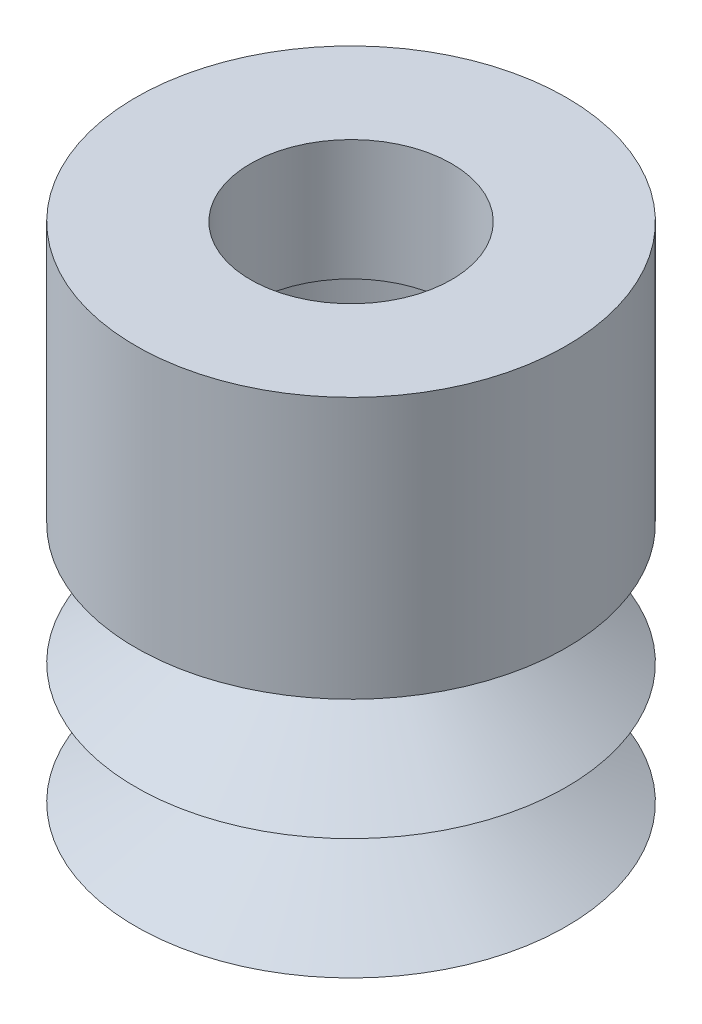
ISO-10303-21;
HEADER;
FILE_DESCRIPTION(('STEP AP214'),'2;1');
FILE_NAME('part.step','',(''),(''),'','','');
FILE_SCHEMA(('AUTOMOTIVE_DESIGN { 1 0 10303 214 1 1 1 1 }'));
ENDSEC;
DATA;
#1=APPLICATION_CONTEXT('core data for automotive mechanical design processes');
#2=APPLICATION_PROTOCOL_DEFINITION('international standard','automotive_design',2000,#1);
#3=PRODUCT_CONTEXT('',#1,'mechanical');
#4=PRODUCT('Part','Part','',(#3));
#5=PRODUCT_RELATED_PRODUCT_CATEGORY('part','',(#4));
#6=PRODUCT_DEFINITION_FORMATION('','',#4);
#7=PRODUCT_DEFINITION_CONTEXT('part definition',#1,'design');
#8=PRODUCT_DEFINITION('design','',#6,#7);
#9=PRODUCT_DEFINITION_SHAPE('','',#8);
#10=(LENGTH_UNIT() NAMED_UNIT(*) SI_UNIT(.MILLI.,.METRE.));
#11=(NAMED_UNIT(*) PLANE_ANGLE_UNIT() SI_UNIT($,.RADIAN.));
#12=(NAMED_UNIT(*) SI_UNIT($,.STERADIAN.) SOLID_ANGLE_UNIT());
#13=UNCERTAINTY_MEASURE_WITH_UNIT(LENGTH_MEASURE(1.E-05),#10,'distance_accuracy_value','');
#14=(GEOMETRIC_REPRESENTATION_CONTEXT(3) GLOBAL_UNCERTAINTY_ASSIGNED_CONTEXT((#13)) GLOBAL_UNIT_ASSIGNED_CONTEXT((#10,
#11,#12)) REPRESENTATION_CONTEXT('',''));
#15=CARTESIAN_POINT('',(0.,0.,0.));
#16=DIRECTION('',(0.,0.,1.));
#17=DIRECTION('',(1.,0.,0.));
#18=AXIS2_PLACEMENT_3D('',#15,#16,#17);
#19=CARTESIAN_POINT('',(0.,0.,0.));
#20=DIRECTION('',(0.,-1.,0.));
#21=DIRECTION('',(0.,0.,-1.));
#22=AXIS2_PLACEMENT_3D('',#19,#20,#21);
#23=CYLINDRICAL_SURFACE('',#22,2.5);
#24=CARTESIAN_POINT('',(0.,12.5,0.));
#25=DIRECTION('',(0.,-1.,0.));
#26=DIRECTION('',(0.,0.,-1.));
#27=AXIS2_PLACEMENT_3D('',#24,#25,#26);
#28=CIRCLE('',#27,2.5);
#29=CARTESIAN_POINT('',(0.,12.5,-2.5));
#30=VERTEX_POINT('',#29);
#31=EDGE_CURVE('E10',#30,#30,#28,.T.);
#32=ORIENTED_EDGE('',*,*,#31,.F.);
#33=EDGE_LOOP('',(#32));
#34=FACE_BOUND('',#33,.T.);
#35=CARTESIAN_POINT('',(0.,9.5,0.));
#36=DIRECTION('',(0.,-1.,0.));
#37=DIRECTION('',(0.,0.,-1.));
#38=AXIS2_PLACEMENT_3D('',#35,#36,#37);
#39=CIRCLE('',#38,2.5);
#40=CARTESIAN_POINT('',(0.,9.5,-2.5));
#41=VERTEX_POINT('',#40);
#42=EDGE_CURVE('E79',#41,#41,#39,.T.);
#43=ORIENTED_EDGE('',*,*,#42,.T.);
#44=EDGE_LOOP('',(#43));
#45=FACE_BOUND('',#44,.T.);
#46=ADVANCED_FACE('F30',(#34,#45),#23,.F.);
#47=CARTESIAN_POINT('',(-2.5,12.5,0.));
#48=DIRECTION('',(0.,-1.,0.));
#49=DIRECTION('',(0.,0.,-1.));
#50=AXIS2_PLACEMENT_3D('',#47,#48,#49);
#51=PLANE('',#50);
#52=CARTESIAN_POINT('',(0.,12.5,0.));
#53=DIRECTION('',(0.,-1.,0.));
#54=DIRECTION('',(0.,0.,-1.));
#55=AXIS2_PLACEMENT_3D('',#52,#53,#54);
#56=CIRCLE('',#55,5.35);
#57=CARTESIAN_POINT('',(0.,12.5,-5.35));
#58=VERTEX_POINT('',#57);
#59=EDGE_CURVE('E36',#58,#58,#56,.T.);
#60=ORIENTED_EDGE('',*,*,#59,.F.);
#61=EDGE_LOOP('',(#60));
#62=FACE_BOUND('',#61,.T.);
#63=ORIENTED_EDGE('',*,*,#31,.T.);
#64=EDGE_LOOP('',(#63));
#65=FACE_BOUND('',#64,.T.);
#66=ADVANCED_FACE('F158',(#62,#65),#51,.F.);
#67=CARTESIAN_POINT('',(0.,0.,0.));
#68=DIRECTION('',(0.,-1.,0.));
#69=DIRECTION('',(0.,0.,-1.));
#70=AXIS2_PLACEMENT_3D('',#67,#68,#69);
#71=CYLINDRICAL_SURFACE('',#70,5.35);
#72=CARTESIAN_POINT('',(0.,6.,0.));
#73=DIRECTION('',(0.,-1.,0.));
#74=DIRECTION('',(0.,0.,-1.));
#75=AXIS2_PLACEMENT_3D('',#72,#73,#74);
#76=CIRCLE('',#75,5.35);
#77=CARTESIAN_POINT('',(0.,6.,-5.35));
#78=VERTEX_POINT('',#77);
#79=EDGE_CURVE('E40',#78,#78,#76,.T.);
#80=ORIENTED_EDGE('',*,*,#79,.F.);
#81=EDGE_LOOP('',(#80));
#82=FACE_BOUND('',#81,.T.);
#83=ORIENTED_EDGE('',*,*,#59,.T.);
#84=EDGE_LOOP('',(#83));
#85=FACE_BOUND('',#84,.T.);
#86=ADVANCED_FACE('F153',(#82,#85),#71,.T.);
#87=CARTESIAN_POINT('',(0.,6.,0.));
#88=DIRECTION('',(0.,1.,0.));
#89=DIRECTION('',(0.,0.,1.));
#90=AXIS2_PLACEMENT_3D('',#87,#88,#89);
#91=CONICAL_SURFACE('',#90,5.35,1.16719111909142);
#92=CARTESIAN_POINT('',(0.,4.84696667928396,0.));
#93=DIRECTION('',(0.,-1.,0.));
#94=DIRECTION('',(0.,0.,-1.));
#95=AXIS2_PLACEMENT_3D('',#92,#93,#94);
#96=CIRCLE('',#95,2.65);
#97=CARTESIAN_POINT('',(0.,4.84696667928396,-2.65));
#98=VERTEX_POINT('',#97);
#99=EDGE_CURVE('E44',#98,#98,#96,.T.);
#100=ORIENTED_EDGE('',*,*,#99,.F.);
#101=EDGE_LOOP('',(#100));
#102=FACE_BOUND('',#101,.T.);
#103=ORIENTED_EDGE('',*,*,#79,.T.);
#104=EDGE_LOOP('',(#103));
#105=FACE_BOUND('',#104,.T.);
#106=ADVANCED_FACE('F147',(#102,#105),#91,.T.);
#107=CARTESIAN_POINT('',(0.,4.84696667928396,0.));
#108=DIRECTION('',(0.,-1.,0.));
#109=DIRECTION('',(0.,0.,-1.));
#110=AXIS2_PLACEMENT_3D('',#107,#108,#109);
#111=CONICAL_SURFACE('',#110,2.65,0.970847468274667);
#112=CARTESIAN_POINT('',(0.,3.,0.));
#113=DIRECTION('',(0.,-1.,0.));
#114=DIRECTION('',(0.,0.,-1.));
#115=AXIS2_PLACEMENT_3D('',#112,#113,#114);
#116=CIRCLE('',#115,5.35);
#117=CARTESIAN_POINT('',(0.,3.,-5.35));
#118=VERTEX_POINT('',#117);
#119=EDGE_CURVE('E49',#118,#118,#116,.T.);
#120=ORIENTED_EDGE('',*,*,#119,.F.);
#121=EDGE_LOOP('',(#120));
#122=FACE_BOUND('',#121,.T.);
#123=ORIENTED_EDGE('',*,*,#99,.T.);
#124=EDGE_LOOP('',(#123));
#125=FACE_BOUND('',#124,.T.);
#126=ADVANCED_FACE('F141',(#122,#125),#111,.T.);
#127=CARTESIAN_POINT('',(0.,3.,0.));
#128=DIRECTION('',(0.,1.,0.));
#129=DIRECTION('',(0.,0.,1.));
#130=AXIS2_PLACEMENT_3D('',#127,#128,#129);
#131=CONICAL_SURFACE('',#130,5.35,1.06023400877395);
#132=CARTESIAN_POINT('',(0.,1.4877375456614,0.));
#133=DIRECTION('',(0.,-1.,0.));
#134=DIRECTION('',(0.,0.,-1.));
#135=AXIS2_PLACEMENT_3D('',#132,#133,#134);
#136=CIRCLE('',#135,2.65);
#137=CARTESIAN_POINT('',(0.,1.4877375456614,-2.65));
#138=VERTEX_POINT('',#137);
#139=EDGE_CURVE('E52',#138,#138,#136,.T.);
#140=ORIENTED_EDGE('',*,*,#139,.F.);
#141=EDGE_LOOP('',(#140));
#142=FACE_BOUND('',#141,.T.);
#143=ORIENTED_EDGE('',*,*,#119,.T.);
#144=EDGE_LOOP('',(#143));
#145=FACE_BOUND('',#144,.T.);
#146=ADVANCED_FACE('F135',(#142,#145),#131,.T.);
#147=CARTESIAN_POINT('',(0.,1.4877375456614,0.));
#148=DIRECTION('',(0.,-1.,0.));
#149=DIRECTION('',(0.,0.,-1.));
#150=AXIS2_PLACEMENT_3D('',#147,#148,#149);
#151=CONICAL_SURFACE('',#150,2.65,1.06717501859919);
#152=CARTESIAN_POINT('',(0.,0.,0.));
#153=DIRECTION('',(0.,-1.,0.));
#154=DIRECTION('',(0.,0.,-1.));
#155=AXIS2_PLACEMENT_3D('',#152,#153,#154);
#156=CIRCLE('',#155,5.35);
#157=CARTESIAN_POINT('',(0.,0.,-5.35));
#158=VERTEX_POINT('',#157);
#159=EDGE_CURVE('E55',#158,#158,#156,.T.);
#160=ORIENTED_EDGE('',*,*,#159,.F.);
#161=EDGE_LOOP('',(#160));
#162=FACE_BOUND('',#161,.T.);
#163=ORIENTED_EDGE('',*,*,#139,.T.);
#164=EDGE_LOOP('',(#163));
#165=FACE_BOUND('',#164,.T.);
#166=ADVANCED_FACE('F129',(#162,#165),#151,.T.);
#167=CARTESIAN_POINT('',(-5.35,0.,0.));
#168=DIRECTION('',(0.,1.,0.));
#169=DIRECTION('',(0.,0.,1.));
#170=AXIS2_PLACEMENT_3D('',#167,#168,#169);
#171=PLANE('',#170);
#172=CARTESIAN_POINT('',(0.,0.,0.));
#173=DIRECTION('',(0.,-1.,0.));
#174=DIRECTION('',(0.,0.,-1.));
#175=AXIS2_PLACEMENT_3D('',#172,#173,#174);
#176=CIRCLE('',#175,3.15180726034036);
#177=CARTESIAN_POINT('',(0.,0.,-3.15180726034036));
#178=VERTEX_POINT('',#177);
#179=EDGE_CURVE('E58',#178,#178,#176,.T.);
#180=ORIENTED_EDGE('',*,*,#179,.F.);
#181=EDGE_LOOP('',(#180));
#182=FACE_BOUND('',#181,.T.);
#183=ORIENTED_EDGE('',*,*,#159,.T.);
#184=EDGE_LOOP('',(#183));
#185=FACE_BOUND('',#184,.T.);
#186=ADVANCED_FACE('F123',(#182,#185),#171,.F.);
#187=CARTESIAN_POINT('',(0.,0.,0.));
#188=DIRECTION('',(0.,-1.,0.));
#189=DIRECTION('',(0.,0.,-1.));
#190=AXIS2_PLACEMENT_3D('',#187,#188,#189);
#191=CONICAL_SURFACE('',#190,3.15180726034036,0.954829138788573);
#192=CARTESIAN_POINT('',(0.,1.4877375456614,0.));
#193=DIRECTION('',(0.,-1.,0.));
#194=DIRECTION('',(0.,0.,-1.));
#195=AXIS2_PLACEMENT_3D('',#192,#193,#194);
#196=CIRCLE('',#195,1.05000287120838);
#197=CARTESIAN_POINT('',(0.,1.4877375456614,-1.05000287120838));
#198=VERTEX_POINT('',#197);
#199=EDGE_CURVE('E61',#198,#198,#196,.T.);
#200=CARTESIAN_POINT('',(0.,1.4877375456614,-1.05000287120838));
#201=CARTESIAN_POINT('',(0.,1.47224027956076,-1.0718966669285));
#202=CARTESIAN_POINT('',(0.,1.45674301346012,-1.09379046264863));
#203=CARTESIAN_POINT('',(0.,1.42574848125884,-1.13757805408888));
#204=CARTESIAN_POINT('',(0.,1.4102512151582,-1.159471849809));
#205=CARTESIAN_POINT('',(0.,1.37925668295692,-1.20325944124925));
#206=CARTESIAN_POINT('',(0.,1.36375941685628,-1.22515323696938));
#207=CARTESIAN_POINT('',(0.,1.33276488465501,-1.26894082840963));
#208=CARTESIAN_POINT('',(0.,1.31726761855437,-1.29083462412975));
#209=CARTESIAN_POINT('',(0.,1.28627308635309,-1.33462221557));
#210=CARTESIAN_POINT('',(0.,1.27077582025245,-1.35651601129012));
#211=CARTESIAN_POINT('',(0.,1.23978128805117,-1.40030360273037));
#212=CARTESIAN_POINT('',(0.,1.22428402195053,-1.4221973984505));
#213=CARTESIAN_POINT('',(0.,1.19328948974925,-1.46598498989075));
#214=CARTESIAN_POINT('',(0.,1.17779222364861,-1.48787878561087));
#215=CARTESIAN_POINT('',(0.,1.14679769144733,-1.53166637705112));
#216=CARTESIAN_POINT('',(0.,1.13130042534669,-1.55356017277125));
#217=CARTESIAN_POINT('',(0.,1.10030589314541,-1.5973477642115));
#218=CARTESIAN_POINT('',(0.,1.08480862704477,-1.61924155993162));
#219=CARTESIAN_POINT('',(0.,1.05381409484349,-1.66302915137187));
#220=CARTESIAN_POINT('',(0.,1.03831682874285,-1.684922947092));
#221=CARTESIAN_POINT('',(0.,1.00732229654157,-1.72871053853225));
#222=CARTESIAN_POINT('',(0.,0.991825030440934,-1.75060433425237));
#223=CARTESIAN_POINT('',(0.,0.960830498239655,-1.79439192569262));
#224=CARTESIAN_POINT('',(0.,0.945333232139015,-1.81628572141274));
#225=CARTESIAN_POINT('',(0.,0.914338699937736,-1.86007331285299));
#226=CARTESIAN_POINT('',(0.,0.898841433837097,-1.88196710857312));
#227=CARTESIAN_POINT('',(0.,0.867846901635817,-1.92575470001337));
#228=CARTESIAN_POINT('',(0.,0.852349635535178,-1.94764849573349));
#229=CARTESIAN_POINT('',(0.,0.821355103333899,-1.99143608717374));
#230=CARTESIAN_POINT('',(0.,0.805857837233259,-2.01332988289387));
#231=CARTESIAN_POINT('',(0.,0.77486330503198,-2.05711747433412));
#232=CARTESIAN_POINT('',(0.,0.75936603893134,-2.07901127005424));
#233=CARTESIAN_POINT('',(0.,0.728371506730061,-2.12279886149449));
#234=CARTESIAN_POINT('',(0.,0.712874240629422,-2.14469265721462));
#235=CARTESIAN_POINT('',(0.,0.681879708428142,-2.18848024865487));
#236=CARTESIAN_POINT('',(0.,0.666382442327503,-2.21037404437499));
#237=CARTESIAN_POINT('',(0.,0.635387910126223,-2.25416163581524));
#238=CARTESIAN_POINT('',(0.,0.619890644025584,-2.27605543153536));
#239=CARTESIAN_POINT('',(0.,0.588896111824305,-2.31984302297561));
#240=CARTESIAN_POINT('',(0.,0.573398845723665,-2.34173681869574));
#241=CARTESIAN_POINT('',(0.,0.542404313522386,-2.38552441013599));
#242=CARTESIAN_POINT('',(0.,0.526907047421746,-2.40741820585611));
#243=CARTESIAN_POINT('',(0.,0.495912515220467,-2.45120579729636));
#244=CARTESIAN_POINT('',(0.,0.480415249119828,-2.47309959301649));
#245=CARTESIAN_POINT('',(0.,0.449420716918548,-2.51688718445674));
#246=CARTESIAN_POINT('',(0.,0.433923450817909,-2.53878098017686));
#247=CARTESIAN_POINT('',(0.,0.402928918616629,-2.58256857161711));
#248=CARTESIAN_POINT('',(0.,0.38743165251599,-2.60446236733724));
#249=CARTESIAN_POINT('',(0.,0.356437120314711,-2.64824995877749));
#250=CARTESIAN_POINT('',(0.,0.340939854214071,-2.67014375449761));
#251=CARTESIAN_POINT('',(0.,0.309945322012792,-2.71393134593786));
#252=CARTESIAN_POINT('',(0.,0.294448055912152,-2.73582514165798));
#253=CARTESIAN_POINT('',(0.,0.263453523710873,-2.77961273309823));
#254=CARTESIAN_POINT('',(0.,0.247956257610233,-2.80150652881836));
#255=CARTESIAN_POINT('',(0.,0.216961725408954,-2.84529412025861));
#256=CARTESIAN_POINT('',(0.,0.201464459308315,-2.86718791597873));
#257=CARTESIAN_POINT('',(0.,0.170469927107035,-2.91097550741898));
#258=CARTESIAN_POINT('',(0.,0.154972661006396,-2.93286930313911));
#259=CARTESIAN_POINT('',(0.,0.123978128805117,-2.97665689457936));
#260=CARTESIAN_POINT('',(0.,0.108480862704477,-2.99855069029948));
#261=CARTESIAN_POINT('',(0.,0.0774863305031979,-3.04233828173973));
#262=CARTESIAN_POINT('',(0.,0.0619890644025583,-3.06423207745986));
#263=CARTESIAN_POINT('',(0.,0.0309945322012792,-3.10801966890011));
#264=CARTESIAN_POINT('',(0.,0.0154972661006396,-3.12991346462023));
#265=CARTESIAN_POINT('',(0.,0.,-3.15180726034036));
#266=B_SPLINE_CURVE_WITH_KNOTS('',3,(#200,#201,#202,#203,#204,#205,#206,#207,#208,#209,#210,
#211,#212,#213,#214,#215,#216,#217,#218,#219,#220,#221,#222,#223,#224,#225,#226,#227,#228,#229,
#230,#231,#232,#233,#234,#235,#236,#237,#238,#239,#240,#241,#242,#243,#244,#245,#246,#247,#248,
#249,#250,#251,#252,#253,#254,#255,#256,#257,#258,#259,#260,#261,#262,#263,#264,#265),
.UNSPECIFIED.,.F.,.F.,(4,2,2,2,2,2,2,2,2,2,2,2,2,2,2,2,2,2,2,2,2,2,2,2,2,2,2,2,2,2,2,2,4),(0.,
0.0804706898731288,0.160941379746258,0.241412069619387,0.321882759492515,0.402353449365644,
0.482824139238773,0.563294829111902,0.64376551898503,0.72423620885816,0.804706898731288,
0.885177588604417,0.965648278477546,1.04611896835068,1.1265896582238,1.20706034809693,
1.28753103797006,1.36800172784319,1.44847241771632,1.52894310758945,1.60941379746258,
1.68988448733571,1.77035517720883,1.85082586708196,1.93129655695509,2.01176724682822,
2.09223793670135,2.17270862657448,2.25317931644761,2.33365000632074,2.41412069619386,
2.49459138606699,2.57506207594012),.UNSPECIFIED.);
#267=EDGE_CURVE('BSEAM117',#198,#178,#266,.T.);
#268=ORIENTED_EDGE('',*,*,#199,.F.);
#269=ORIENTED_EDGE('',*,*,#179,.T.);
#270=ORIENTED_EDGE('',*,*,#267,.T.);
#271=ORIENTED_EDGE('',*,*,#267,.F.);
#272=EDGE_LOOP('',(#268,#270,#269,#271));
#273=FACE_BOUND('',#272,.T.);
#274=ADVANCED_FACE('F117',(#273),#191,.F.);
#275=CARTESIAN_POINT('',(0.,1.4877375456614,0.));
#276=DIRECTION('',(0.,1.,0.));
#277=DIRECTION('',(0.,0.,1.));
#278=AXIS2_PLACEMENT_3D('',#275,#276,#277);
#279=CONICAL_SURFACE('',#278,1.05000287120838,1.06023400877395);
#280=CARTESIAN_POINT('',(0.,3.,0.));
#281=DIRECTION('',(0.,-1.,0.));
#282=DIRECTION('',(0.,0.,-1.));
#283=AXIS2_PLACEMENT_3D('',#280,#281,#282);
#284=CIRCLE('',#283,3.75000287120838);
#285=CARTESIAN_POINT('',(0.,3.,-3.75000287120838));
#286=VERTEX_POINT('',#285);
#287=EDGE_CURVE('E64',#286,#286,#284,.T.);
#288=ORIENTED_EDGE('',*,*,#287,.F.);
#289=EDGE_LOOP('',(#288));
#290=FACE_BOUND('',#289,.T.);
#291=ORIENTED_EDGE('',*,*,#199,.T.);
#292=EDGE_LOOP('',(#291));
#293=FACE_BOUND('',#292,.T.);
#294=ADVANCED_FACE('F111',(#290,#293),#279,.F.);
#295=CARTESIAN_POINT('',(0.,3.,0.));
#296=DIRECTION('',(0.,-1.,0.));
#297=DIRECTION('',(0.,0.,-1.));
#298=AXIS2_PLACEMENT_3D('',#295,#296,#297);
#299=CONICAL_SURFACE('',#298,3.75000287120838,0.970847468274668);
#300=CARTESIAN_POINT('',(0.,4.19710999695301,0.));
#301=DIRECTION('',(0.,-1.,0.));
#302=DIRECTION('',(0.,0.,-1.));
#303=AXIS2_PLACEMENT_3D('',#300,#301,#302);
#304=CIRCLE('',#303,2.);
#305=CARTESIAN_POINT('',(0.,4.19710999695301,-2.));
#306=VERTEX_POINT('',#305);
#307=EDGE_CURVE('E67',#306,#306,#304,.T.);
#308=ORIENTED_EDGE('',*,*,#307,.F.);
#309=EDGE_LOOP('',(#308));
#310=FACE_BOUND('',#309,.T.);
#311=ORIENTED_EDGE('',*,*,#287,.T.);
#312=EDGE_LOOP('',(#311));
#313=FACE_BOUND('',#312,.T.);
#314=ADVANCED_FACE('F105',(#310,#313),#299,.F.);
#315=CARTESIAN_POINT('',(0.,0.,0.));
#316=DIRECTION('',(0.,-1.,0.));
#317=DIRECTION('',(0.,0.,-1.));
#318=AXIS2_PLACEMENT_3D('',#315,#316,#317);
#319=CYLINDRICAL_SURFACE('',#318,2.);
#320=CARTESIAN_POINT('',(0.,7.9,0.));
#321=DIRECTION('',(0.,-1.,0.));
#322=DIRECTION('',(0.,0.,-1.));
#323=AXIS2_PLACEMENT_3D('',#320,#321,#322);
#324=CIRCLE('',#323,2.);
#325=CARTESIAN_POINT('',(0.,7.9,-2.));
#326=VERTEX_POINT('',#325);
#327=EDGE_CURVE('E70',#326,#326,#324,.T.);
#328=ORIENTED_EDGE('',*,*,#327,.F.);
#329=EDGE_LOOP('',(#328));
#330=FACE_BOUND('',#329,.T.);
#331=ORIENTED_EDGE('',*,*,#307,.T.);
#332=EDGE_LOOP('',(#331));
#333=FACE_BOUND('',#332,.T.);
#334=ADVANCED_FACE('F99',(#330,#333),#319,.F.);
#335=CARTESIAN_POINT('',(-2.,7.9,0.));
#336=DIRECTION('',(0.,-1.,0.));
#337=DIRECTION('',(0.,0.,-1.));
#338=AXIS2_PLACEMENT_3D('',#335,#336,#337);
#339=PLANE('',#338);
#340=CARTESIAN_POINT('',(0.,7.9,0.));
#341=DIRECTION('',(0.,-1.,0.));
#342=DIRECTION('',(0.,0.,-1.));
#343=AXIS2_PLACEMENT_3D('',#340,#341,#342);
#344=CIRCLE('',#343,4.);
#345=CARTESIAN_POINT('',(0.,7.9,-4.));
#346=VERTEX_POINT('',#345);
#347=EDGE_CURVE('E73',#346,#346,#344,.T.);
#348=ORIENTED_EDGE('',*,*,#347,.F.);
#349=EDGE_LOOP('',(#348));
#350=FACE_BOUND('',#349,.T.);
#351=ORIENTED_EDGE('',*,*,#327,.T.);
#352=EDGE_LOOP('',(#351));
#353=FACE_BOUND('',#352,.T.);
#354=ADVANCED_FACE('F93',(#350,#353),#339,.F.);
#355=CARTESIAN_POINT('',(0.,0.,0.));
#356=DIRECTION('',(0.,-1.,0.));
#357=DIRECTION('',(0.,0.,-1.));
#358=AXIS2_PLACEMENT_3D('',#355,#356,#357);
#359=CYLINDRICAL_SURFACE('',#358,4.);
#360=CARTESIAN_POINT('',(0.,9.5,0.));
#361=DIRECTION('',(0.,-1.,0.));
#362=DIRECTION('',(0.,0.,-1.));
#363=AXIS2_PLACEMENT_3D('',#360,#361,#362);
#364=CIRCLE('',#363,4.);
#365=CARTESIAN_POINT('',(0.,9.5,-4.));
#366=VERTEX_POINT('',#365);
#367=EDGE_CURVE('E76',#366,#366,#364,.T.);
#368=ORIENTED_EDGE('',*,*,#367,.F.);
#369=EDGE_LOOP('',(#368));
#370=FACE_BOUND('',#369,.T.);
#371=ORIENTED_EDGE('',*,*,#347,.T.);
#372=EDGE_LOOP('',(#371));
#373=FACE_BOUND('',#372,.T.);
#374=ADVANCED_FACE('F87',(#370,#373),#359,.F.);
#375=CARTESIAN_POINT('',(-4.,9.5,0.));
#376=DIRECTION('',(0.,1.,0.));
#377=DIRECTION('',(0.,0.,1.));
#378=AXIS2_PLACEMENT_3D('',#375,#376,#377);
#379=PLANE('',#378);
#380=ORIENTED_EDGE('',*,*,#42,.F.);
#381=EDGE_LOOP('',(#380));
#382=FACE_BOUND('',#381,.T.);
#383=ORIENTED_EDGE('',*,*,#367,.T.);
#384=EDGE_LOOP('',(#383));
#385=FACE_BOUND('',#384,.T.);
#386=ADVANCED_FACE('F84',(#382,#385),#379,.F.);
#387=CLOSED_SHELL('',(#46,#66,#86,#106,#126,#146,#166,#186,#274,#294,#314,#334,#354,#374,#386));
#388=MANIFOLD_SOLID_BREP('B2',#387);
#389=ADVANCED_BREP_SHAPE_REPRESENTATION('',(#18,#388),#14);
#390=SHAPE_DEFINITION_REPRESENTATION(#9,#389);
ENDSEC;
END-ISO-10303-21;
